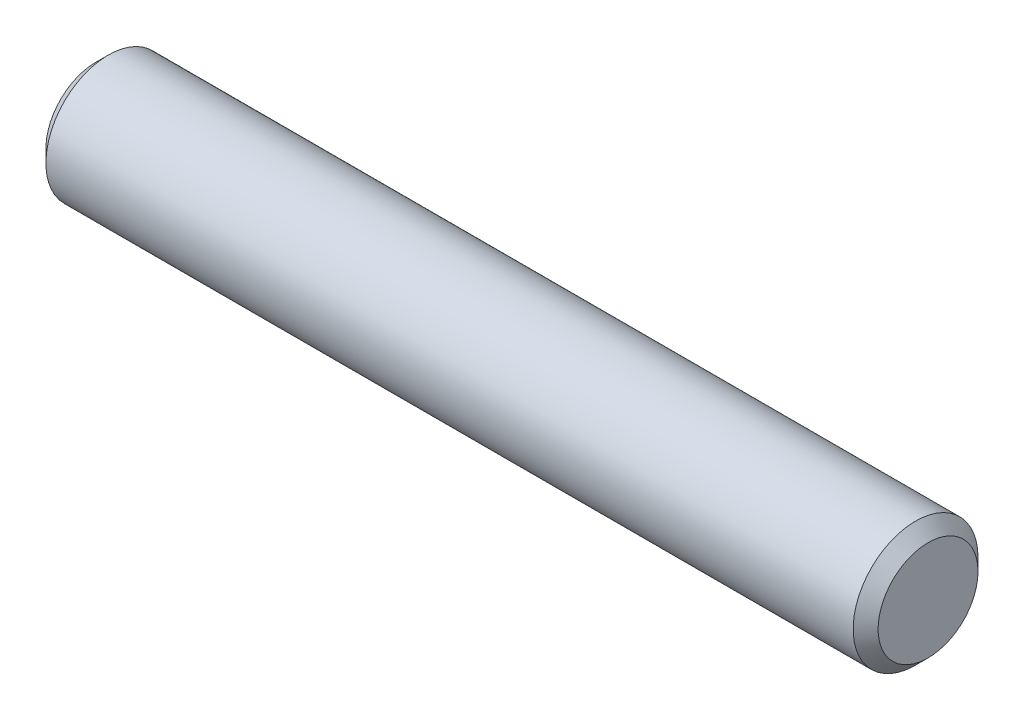
ISO-10303-21;
HEADER;
FILE_DESCRIPTION(('STEP AP214'),'2;1');
FILE_NAME('part.step','',(''),(''),'','','');
FILE_SCHEMA(('AUTOMOTIVE_DESIGN { 1 0 10303 214 1 1 1 1 }'));
ENDSEC;
DATA;
#1=APPLICATION_CONTEXT('core data for automotive mechanical design processes');
#2=APPLICATION_PROTOCOL_DEFINITION('international standard','automotive_design',2000,#1);
#3=PRODUCT_CONTEXT('',#1,'mechanical');
#4=PRODUCT('Part','Part','',(#3));
#5=PRODUCT_RELATED_PRODUCT_CATEGORY('part','',(#4));
#6=PRODUCT_DEFINITION_FORMATION('','',#4);
#7=PRODUCT_DEFINITION_CONTEXT('part definition',#1,'design');
#8=PRODUCT_DEFINITION('design','',#6,#7);
#9=PRODUCT_DEFINITION_SHAPE('','',#8);
#10=(LENGTH_UNIT() NAMED_UNIT(*) SI_UNIT(.MILLI.,.METRE.));
#11=(NAMED_UNIT(*) PLANE_ANGLE_UNIT() SI_UNIT($,.RADIAN.));
#12=(NAMED_UNIT(*) SI_UNIT($,.STERADIAN.) SOLID_ANGLE_UNIT());
#13=UNCERTAINTY_MEASURE_WITH_UNIT(LENGTH_MEASURE(1.E-05),#10,'distance_accuracy_value','');
#14=(GEOMETRIC_REPRESENTATION_CONTEXT(3) GLOBAL_UNCERTAINTY_ASSIGNED_CONTEXT((#13)) GLOBAL_UNIT_ASSIGNED_CONTEXT((#10,
#11,#12)) REPRESENTATION_CONTEXT('',''));
#15=CARTESIAN_POINT('',(0.,0.,0.));
#16=DIRECTION('',(0.,0.,1.));
#17=DIRECTION('',(1.,0.,0.));
#18=AXIS2_PLACEMENT_3D('',#15,#16,#17);
#19=CARTESIAN_POINT('',(-15.875,0.,0.));
#20=DIRECTION('',(1.,0.,0.));
#21=DIRECTION('',(0.,0.,-1.));
#22=AXIS2_PLACEMENT_3D('',#19,#20,#21);
#23=CYLINDRICAL_SURFACE('',#22,2.38125);
#24=CARTESIAN_POINT('',(15.39875,0.,0.));
#25=DIRECTION('',(1.,0.,0.));
#26=DIRECTION('',(0.,0.,-1.));
#27=AXIS2_PLACEMENT_3D('',#24,#25,#26);
#28=CIRCLE('',#27,2.38125);
#29=CARTESIAN_POINT('',(15.39875,0.,-2.38125));
#30=VERTEX_POINT('',#29);
#31=EDGE_CURVE('E37',#30,#30,#28,.F.);
#32=ORIENTED_EDGE('',*,*,#31,.T.);
#33=EDGE_LOOP('',(#32));
#34=FACE_BOUND('',#33,.T.);
#35=CARTESIAN_POINT('',(-15.39875,0.,0.));
#36=DIRECTION('',(1.,0.,0.));
#37=DIRECTION('',(0.,0.,-1.));
#38=AXIS2_PLACEMENT_3D('',#35,#36,#37);
#39=CIRCLE('',#38,2.38125);
#40=CARTESIAN_POINT('',(-15.39875,0.,-2.38125));
#41=VERTEX_POINT('',#40);
#42=EDGE_CURVE('E41',#41,#41,#39,.T.);
#43=ORIENTED_EDGE('',*,*,#42,.T.);
#44=EDGE_LOOP('',(#43));
#45=FACE_BOUND('',#44,.T.);
#46=ADVANCED_FACE('F30',(#34,#45),#23,.T.);
#47=CARTESIAN_POINT('',(-15.875,0.,0.));
#48=DIRECTION('',(1.,0.,0.));
#49=DIRECTION('',(0.,0.,-1.));
#50=AXIS2_PLACEMENT_3D('',#47,#48,#49);
#51=PLANE('',#50);
#52=CARTESIAN_POINT('',(-15.875,0.,0.));
#53=DIRECTION('',(1.,0.,0.));
#54=DIRECTION('',(0.,0.,-1.));
#55=AXIS2_PLACEMENT_3D('',#52,#53,#54);
#56=CIRCLE('',#55,1.905);
#57=CARTESIAN_POINT('',(-15.875,0.,-1.905));
#58=VERTEX_POINT('',#57);
#59=EDGE_CURVE('E10',#58,#58,#56,.F.);
#60=ORIENTED_EDGE('',*,*,#59,.T.);
#61=EDGE_LOOP('',(#60));
#62=FACE_BOUND('',#61,.T.);
#63=ADVANCED_FACE('F61',(#62),#51,.F.);
#64=CARTESIAN_POINT('',(15.875,0.,0.));
#65=DIRECTION('',(1.,0.,0.));
#66=DIRECTION('',(0.,0.,-1.));
#67=AXIS2_PLACEMENT_3D('',#64,#65,#66);
#68=PLANE('',#67);
#69=CARTESIAN_POINT('',(15.875,0.,0.));
#70=DIRECTION('',(1.,0.,0.));
#71=DIRECTION('',(0.,0.,-1.));
#72=AXIS2_PLACEMENT_3D('',#69,#70,#71);
#73=CIRCLE('',#72,1.905);
#74=CARTESIAN_POINT('',(15.875,0.,-1.905));
#75=VERTEX_POINT('',#74);
#76=EDGE_CURVE('E45',#75,#75,#73,.T.);
#77=ORIENTED_EDGE('',*,*,#76,.T.);
#78=EDGE_LOOP('',(#77));
#79=FACE_BOUND('',#78,.T.);
#80=ADVANCED_FACE('F51',(#79),#68,.T.);
#81=CARTESIAN_POINT('',(15.875,0.,0.));
#82=DIRECTION('',(-1.,0.,0.));
#83=DIRECTION('',(0.,0.,1.));
#84=AXIS2_PLACEMENT_3D('',#81,#82,#83);
#85=CONICAL_SURFACE('',#84,1.905,0.785398163397447);
#86=ORIENTED_EDGE('',*,*,#31,.F.);
#87=EDGE_LOOP('',(#86));
#88=FACE_BOUND('',#87,.T.);
#89=ORIENTED_EDGE('',*,*,#76,.F.);
#90=EDGE_LOOP('',(#89));
#91=FACE_BOUND('',#90,.T.);
#92=ADVANCED_FACE('F53',(#88,#91),#85,.T.);
#93=CARTESIAN_POINT('',(-15.39875,0.,0.));
#94=DIRECTION('',(1.,0.,0.));
#95=DIRECTION('',(0.,0.,-1.));
#96=AXIS2_PLACEMENT_3D('',#93,#94,#95);
#97=CONICAL_SURFACE('',#96,2.38125,0.785398163397447);
#98=ORIENTED_EDGE('',*,*,#59,.F.);
#99=EDGE_LOOP('',(#98));
#100=FACE_BOUND('',#99,.T.);
#101=ORIENTED_EDGE('',*,*,#42,.F.);
#102=EDGE_LOOP('',(#101));
#103=FACE_BOUND('',#102,.T.);
#104=ADVANCED_FACE('F32',(#100,#103),#97,.T.);
#105=CLOSED_SHELL('',(#46,#63,#80,#92,#104));
#106=MANIFOLD_SOLID_BREP('B2',#105);
#107=ADVANCED_BREP_SHAPE_REPRESENTATION('',(#18,#106),#14);
#108=SHAPE_DEFINITION_REPRESENTATION(#9,#107);
ENDSEC;
END-ISO-10303-21;
